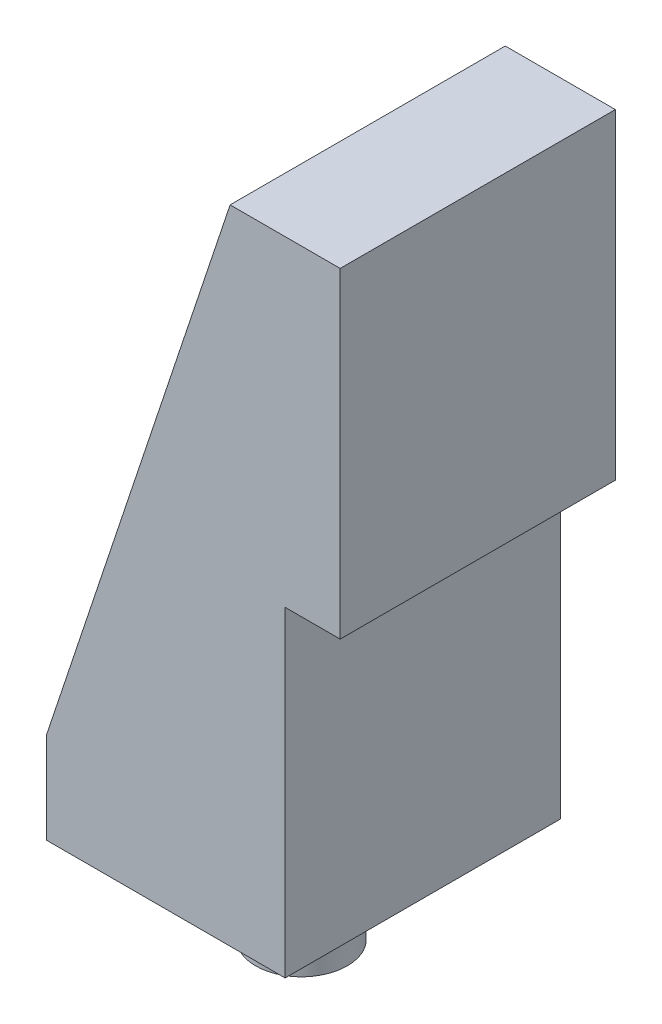
ISO-10303-21;
HEADER;
FILE_DESCRIPTION(('STEP AP214'),'2;1');
FILE_NAME('part.step','',(''),(''),'','','');
FILE_SCHEMA(('AUTOMOTIVE_DESIGN { 1 0 10303 214 1 1 1 1 }'));
ENDSEC;
DATA;
#1=APPLICATION_CONTEXT('core data for automotive mechanical design processes');
#2=APPLICATION_PROTOCOL_DEFINITION('international standard','automotive_design',2000,#1);
#3=PRODUCT_CONTEXT('',#1,'mechanical');
#4=PRODUCT('Part','Part','',(#3));
#5=PRODUCT_RELATED_PRODUCT_CATEGORY('part','',(#4));
#6=PRODUCT_DEFINITION_FORMATION('','',#4);
#7=PRODUCT_DEFINITION_CONTEXT('part definition',#1,'design');
#8=PRODUCT_DEFINITION('design','',#6,#7);
#9=PRODUCT_DEFINITION_SHAPE('','',#8);
#10=(LENGTH_UNIT() NAMED_UNIT(*) SI_UNIT(.MILLI.,.METRE.));
#11=(NAMED_UNIT(*) PLANE_ANGLE_UNIT() SI_UNIT($,.RADIAN.));
#12=(NAMED_UNIT(*) SI_UNIT($,.STERADIAN.) SOLID_ANGLE_UNIT());
#13=UNCERTAINTY_MEASURE_WITH_UNIT(LENGTH_MEASURE(1.E-05),#10,'distance_accuracy_value','');
#14=(GEOMETRIC_REPRESENTATION_CONTEXT(3) GLOBAL_UNCERTAINTY_ASSIGNED_CONTEXT((#13)) GLOBAL_UNIT_ASSIGNED_CONTEXT((#10,
#11,#12)) REPRESENTATION_CONTEXT('',''));
#15=CARTESIAN_POINT('',(0.,0.,0.));
#16=DIRECTION('',(0.,0.,1.));
#17=DIRECTION('',(1.,0.,0.));
#18=AXIS2_PLACEMENT_3D('',#15,#16,#17);
#19=CARTESIAN_POINT('',(0.,0.,1.5));
#20=DIRECTION('',(0.,1.,0.));
#21=DIRECTION('',(0.,0.,1.));
#22=AXIS2_PLACEMENT_3D('',#19,#20,#21);
#23=PLANE('',#22);
#24=DIRECTION('',(1.,0.,0.));
#25=VECTOR('',#24,1.);
#26=CARTESIAN_POINT('',(0.,0.,0.));
#27=LINE('',#26,#25);
#28=CARTESIAN_POINT('',(0.,0.,0.));
#29=VERTEX_POINT('',#28);
#30=CARTESIAN_POINT('',(1.3,0.,0.));
#31=VERTEX_POINT('',#30);
#32=EDGE_CURVE('E130',#29,#31,#27,.T.);
#33=ORIENTED_EDGE('',*,*,#32,.T.);
#34=DIRECTION('',(0.,0.,-1.));
#35=VECTOR('',#34,1.);
#36=CARTESIAN_POINT('',(1.3,0.,1.5));
#37=LINE('',#36,#35);
#38=CARTESIAN_POINT('',(1.3,0.,1.5));
#39=VERTEX_POINT('',#38);
#40=EDGE_CURVE('E147',#39,#31,#37,.T.);
#41=ORIENTED_EDGE('',*,*,#40,.F.);
#42=DIRECTION('',(1.,0.,0.));
#43=VECTOR('',#42,1.);
#44=CARTESIAN_POINT('',(0.,0.,1.5));
#45=LINE('',#44,#43);
#46=CARTESIAN_POINT('',(0.,0.,1.5));
#47=VERTEX_POINT('',#46);
#48=EDGE_CURVE('E92',#47,#39,#45,.T.);
#49=ORIENTED_EDGE('',*,*,#48,.F.);
#50=DIRECTION('',(0.,0.,-1.));
#51=VECTOR('',#50,1.);
#52=CARTESIAN_POINT('',(0.,0.,1.5));
#53=LINE('',#52,#51);
#54=EDGE_CURVE('E44',#47,#29,#53,.T.);
#55=ORIENTED_EDGE('',*,*,#54,.T.);
#56=EDGE_LOOP('',(#33,#41,#49,#55));
#57=FACE_BOUND('',#56,.T.);
#58=CARTESIAN_POINT('',(0.662330501171482,0.,0.77331630145494));
#59=DIRECTION('',(0.,1.,0.));
#60=DIRECTION('',(0.,0.,1.));
#61=AXIS2_PLACEMENT_3D('',#58,#59,#60);
#62=CIRCLE('',#61,0.25);
#63=CARTESIAN_POINT('',(0.662330501171482,0.,1.02331630145494));
#64=VERTEX_POINT('',#63);
#65=EDGE_CURVE('E11',#64,#64,#62,.F.);
#66=ORIENTED_EDGE('',*,*,#65,.F.);
#67=EDGE_LOOP('',(#66));
#68=FACE_BOUND('',#67,.T.);
#69=ADVANCED_FACE('F35',(#57,#68),#23,.F.);
#70=CARTESIAN_POINT('',(0.,0.5,1.5));
#71=DIRECTION('',(1.,0.,0.));
#72=DIRECTION('',(0.,1.,0.));
#73=AXIS2_PLACEMENT_3D('',#70,#71,#72);
#74=PLANE('',#73);
#75=DIRECTION('',(0.,-1.,0.));
#76=VECTOR('',#75,1.);
#77=CARTESIAN_POINT('',(0.,0.5,0.));
#78=LINE('',#77,#76);
#79=CARTESIAN_POINT('',(0.,0.5,0.));
#80=VERTEX_POINT('',#79);
#81=EDGE_CURVE('E127',#80,#29,#78,.T.);
#82=ORIENTED_EDGE('',*,*,#81,.T.);
#83=ORIENTED_EDGE('',*,*,#54,.F.);
#84=DIRECTION('',(0.,-1.,0.));
#85=VECTOR('',#84,1.);
#86=CARTESIAN_POINT('',(0.,0.5,1.5));
#87=LINE('',#86,#85);
#88=CARTESIAN_POINT('',(0.,0.5,1.5));
#89=VERTEX_POINT('',#88);
#90=EDGE_CURVE('E140',#89,#47,#87,.T.);
#91=ORIENTED_EDGE('',*,*,#90,.F.);
#92=DIRECTION('',(0.,0.,-1.));
#93=VECTOR('',#92,1.);
#94=CARTESIAN_POINT('',(0.,0.5,1.5));
#95=LINE('',#94,#93);
#96=EDGE_CURVE('E123',#89,#80,#95,.T.);
#97=ORIENTED_EDGE('',*,*,#96,.T.);
#98=EDGE_LOOP('',(#82,#83,#91,#97));
#99=FACE_BOUND('',#98,.T.);
#100=ADVANCED_FACE('F37',(#99),#74,.F.);
#101=CARTESIAN_POINT('',(1.3,0.,1.5));
#102=DIRECTION('',(-1.,0.,0.));
#103=DIRECTION('',(0.,0.,1.));
#104=AXIS2_PLACEMENT_3D('',#101,#102,#103);
#105=PLANE('',#104);
#106=DIRECTION('',(0.,1.,0.));
#107=VECTOR('',#106,1.);
#108=CARTESIAN_POINT('',(1.3,0.,0.));
#109=LINE('',#108,#107);
#110=CARTESIAN_POINT('',(1.3,1.75,0.));
#111=VERTEX_POINT('',#110);
#112=EDGE_CURVE('E133',#31,#111,#109,.T.);
#113=ORIENTED_EDGE('',*,*,#112,.T.);
#114=DIRECTION('',(0.,0.,-1.));
#115=VECTOR('',#114,1.);
#116=CARTESIAN_POINT('',(1.3,1.75,1.5));
#117=LINE('',#116,#115);
#118=CARTESIAN_POINT('',(1.3,1.75,1.5));
#119=VERTEX_POINT('',#118);
#120=EDGE_CURVE('E144',#119,#111,#117,.T.);
#121=ORIENTED_EDGE('',*,*,#120,.F.);
#122=DIRECTION('',(0.,1.,0.));
#123=VECTOR('',#122,1.);
#124=CARTESIAN_POINT('',(1.3,0.,1.5));
#125=LINE('',#124,#123);
#126=EDGE_CURVE('E164',#39,#119,#125,.T.);
#127=ORIENTED_EDGE('',*,*,#126,.F.);
#128=ORIENTED_EDGE('',*,*,#40,.T.);
#129=EDGE_LOOP('',(#113,#121,#127,#128));
#130=FACE_BOUND('',#129,.T.);
#131=ADVANCED_FACE('F160',(#130),#105,.F.);
#132=CARTESIAN_POINT('',(1.6,1.75,1.5));
#133=DIRECTION('',(0.,1.,0.));
#134=DIRECTION('',(0.,0.,1.));
#135=AXIS2_PLACEMENT_3D('',#132,#133,#134);
#136=PLANE('',#135);
#137=DIRECTION('',(1.,0.,0.));
#138=VECTOR('',#137,1.);
#139=CARTESIAN_POINT('',(1.6,1.75,0.));
#140=LINE('',#139,#138);
#141=CARTESIAN_POINT('',(1.6,1.75,0.));
#142=VERTEX_POINT('',#141);
#143=EDGE_CURVE('E135',#111,#142,#140,.T.);
#144=ORIENTED_EDGE('',*,*,#143,.T.);
#145=DIRECTION('',(0.,0.,-1.));
#146=VECTOR('',#145,1.);
#147=CARTESIAN_POINT('',(1.6,1.75,1.5));
#148=LINE('',#147,#146);
#149=CARTESIAN_POINT('',(1.6,1.75,1.5));
#150=VERTEX_POINT('',#149);
#151=EDGE_CURVE('E118',#150,#142,#148,.T.);
#152=ORIENTED_EDGE('',*,*,#151,.F.);
#153=DIRECTION('',(1.,0.,0.));
#154=VECTOR('',#153,1.);
#155=CARTESIAN_POINT('',(1.6,1.75,1.5));
#156=LINE('',#155,#154);
#157=EDGE_CURVE('E108',#119,#150,#156,.T.);
#158=ORIENTED_EDGE('',*,*,#157,.F.);
#159=ORIENTED_EDGE('',*,*,#120,.T.);
#160=EDGE_LOOP('',(#144,#152,#158,#159));
#161=FACE_BOUND('',#160,.T.);
#162=ADVANCED_FACE('F163',(#161),#136,.F.);
#163=CARTESIAN_POINT('',(1.6,3.5,1.5));
#164=DIRECTION('',(-1.,0.,0.));
#165=DIRECTION('',(0.,-1.,0.));
#166=AXIS2_PLACEMENT_3D('',#163,#164,#165);
#167=PLANE('',#166);
#168=DIRECTION('',(0.,1.,0.));
#169=VECTOR('',#168,1.);
#170=CARTESIAN_POINT('',(1.6,3.5,0.));
#171=LINE('',#170,#169);
#172=CARTESIAN_POINT('',(1.6,3.5,0.));
#173=VERTEX_POINT('',#172);
#174=EDGE_CURVE('E117',#142,#173,#171,.T.);
#175=ORIENTED_EDGE('',*,*,#174,.T.);
#176=DIRECTION('',(0.,0.,-1.));
#177=VECTOR('',#176,1.);
#178=CARTESIAN_POINT('',(1.6,3.5,1.5));
#179=LINE('',#178,#177);
#180=CARTESIAN_POINT('',(1.6,3.5,1.5));
#181=VERTEX_POINT('',#180);
#182=EDGE_CURVE('E114',#181,#173,#179,.T.);
#183=ORIENTED_EDGE('',*,*,#182,.F.);
#184=DIRECTION('',(0.,1.,0.));
#185=VECTOR('',#184,1.);
#186=CARTESIAN_POINT('',(1.6,3.5,1.5));
#187=LINE('',#186,#185);
#188=EDGE_CURVE('E102',#150,#181,#187,.T.);
#189=ORIENTED_EDGE('',*,*,#188,.F.);
#190=ORIENTED_EDGE('',*,*,#151,.T.);
#191=EDGE_LOOP('',(#175,#183,#189,#190));
#192=FACE_BOUND('',#191,.T.);
#193=ADVANCED_FACE('F115',(#192),#167,.F.);
#194=CARTESIAN_POINT('',(1.3,3.5,1.5));
#195=DIRECTION('',(0.,-1.,0.));
#196=DIRECTION('',(1.,0.,0.));
#197=AXIS2_PLACEMENT_3D('',#194,#195,#196);
#198=PLANE('',#197);
#199=DIRECTION('',(-1.,0.,0.));
#200=VECTOR('',#199,1.);
#201=CARTESIAN_POINT('',(1.3,3.5,0.));
#202=LINE('',#201,#200);
#203=CARTESIAN_POINT('',(1.,3.5,0.));
#204=VERTEX_POINT('',#203);
#205=EDGE_CURVE('E77',#173,#204,#202,.T.);
#206=ORIENTED_EDGE('',*,*,#205,.T.);
#207=DIRECTION('',(0.,0.,-1.));
#208=VECTOR('',#207,1.);
#209=CARTESIAN_POINT('',(1.,3.5,1.5));
#210=LINE('',#209,#208);
#211=CARTESIAN_POINT('',(1.,3.5,1.5));
#212=VERTEX_POINT('',#211);
#213=EDGE_CURVE('E119',#212,#204,#210,.T.);
#214=ORIENTED_EDGE('',*,*,#213,.F.);
#215=DIRECTION('',(-1.,0.,0.));
#216=VECTOR('',#215,1.);
#217=CARTESIAN_POINT('',(1.3,3.5,1.5));
#218=LINE('',#217,#216);
#219=EDGE_CURVE('E106',#181,#212,#218,.T.);
#220=ORIENTED_EDGE('',*,*,#219,.F.);
#221=ORIENTED_EDGE('',*,*,#182,.T.);
#222=EDGE_LOOP('',(#206,#214,#220,#221));
#223=FACE_BOUND('',#222,.T.);
#224=ADVANCED_FACE('F121',(#223),#198,.F.);
#225=CARTESIAN_POINT('',(1.,3.5,1.5));
#226=DIRECTION('',(0.948683298050514,-0.316227766016838,0.));
#227=DIRECTION('',(0.316227766016838,0.948683298050514,0.));
#228=AXIS2_PLACEMENT_3D('',#225,#226,#227);
#229=PLANE('',#228);
#230=DIRECTION('',(-0.316227766016838,-0.948683298050514,0.));
#231=VECTOR('',#230,1.);
#232=CARTESIAN_POINT('',(1.,3.5,0.));
#233=LINE('',#232,#231);
#234=EDGE_CURVE('E83',#204,#80,#233,.T.);
#235=ORIENTED_EDGE('',*,*,#234,.T.);
#236=ORIENTED_EDGE('',*,*,#96,.F.);
#237=DIRECTION('',(-0.316227766016838,-0.948683298050514,0.));
#238=VECTOR('',#237,1.);
#239=CARTESIAN_POINT('',(1.,3.5,1.5));
#240=LINE('',#239,#238);
#241=EDGE_CURVE('E52',#212,#89,#240,.T.);
#242=ORIENTED_EDGE('',*,*,#241,.F.);
#243=ORIENTED_EDGE('',*,*,#213,.T.);
#244=EDGE_LOOP('',(#235,#236,#242,#243));
#245=FACE_BOUND('',#244,.T.);
#246=ADVANCED_FACE('F194',(#245),#229,.F.);
#247=CARTESIAN_POINT('',(0.,0.,1.5));
#248=DIRECTION('',(0.,0.,1.));
#249=DIRECTION('',(1.,0.,0.));
#250=AXIS2_PLACEMENT_3D('',#247,#248,#249);
#251=PLANE('',#250);
#252=ORIENTED_EDGE('',*,*,#90,.T.);
#253=ORIENTED_EDGE('',*,*,#48,.T.);
#254=ORIENTED_EDGE('',*,*,#126,.T.);
#255=ORIENTED_EDGE('',*,*,#157,.T.);
#256=ORIENTED_EDGE('',*,*,#188,.T.);
#257=ORIENTED_EDGE('',*,*,#219,.T.);
#258=ORIENTED_EDGE('',*,*,#241,.T.);
#259=EDGE_LOOP('',(#252,#253,#254,#255,#256,#257,#258));
#260=FACE_BOUND('',#259,.T.);
#261=ADVANCED_FACE('F104',(#260),#251,.T.);
#262=CARTESIAN_POINT('',(0.,0.,0.));
#263=DIRECTION('',(0.,0.,1.));
#264=DIRECTION('',(1.,0.,0.));
#265=AXIS2_PLACEMENT_3D('',#262,#263,#264);
#266=PLANE('',#265);
#267=ORIENTED_EDGE('',*,*,#81,.F.);
#268=ORIENTED_EDGE('',*,*,#234,.F.);
#269=ORIENTED_EDGE('',*,*,#205,.F.);
#270=ORIENTED_EDGE('',*,*,#174,.F.);
#271=ORIENTED_EDGE('',*,*,#143,.F.);
#272=ORIENTED_EDGE('',*,*,#112,.F.);
#273=ORIENTED_EDGE('',*,*,#32,.F.);
#274=EDGE_LOOP('',(#267,#268,#269,#270,#271,#272,#273));
#275=FACE_BOUND('',#274,.T.);
#276=ADVANCED_FACE('F155',(#275),#266,.F.);
#277=CARTESIAN_POINT('',(0.662330501171482,-0.5,0.77331630145494));
#278=DIRECTION('',(0.,1.,0.));
#279=DIRECTION('',(0.,0.,1.));
#280=AXIS2_PLACEMENT_3D('',#277,#278,#279);
#281=CYLINDRICAL_SURFACE('',#280,0.25);
#282=CARTESIAN_POINT('',(0.662330501171482,-0.5,0.77331630145494));
#283=DIRECTION('',(0.,-1.,0.));
#284=DIRECTION('',(0.,0.,-1.));
#285=AXIS2_PLACEMENT_3D('',#282,#283,#284);
#286=CIRCLE('',#285,0.25);
#287=CARTESIAN_POINT('',(0.662330501171482,-0.5,0.52331630145494));
#288=VERTEX_POINT('',#287);
#289=EDGE_CURVE('E131',#288,#288,#286,.T.);
#290=ORIENTED_EDGE('',*,*,#289,.F.);
#291=EDGE_LOOP('',(#290));
#292=FACE_BOUND('',#291,.T.);
#293=ORIENTED_EDGE('',*,*,#65,.T.);
#294=EDGE_LOOP('',(#293));
#295=FACE_BOUND('',#294,.T.);
#296=ADVANCED_FACE('F174',(#292,#295),#281,.T.);
#297=CARTESIAN_POINT('',(0.662330501171482,-0.5,0.77331630145494));
#298=DIRECTION('',(0.,-1.,0.));
#299=DIRECTION('',(0.,0.,-1.));
#300=AXIS2_PLACEMENT_3D('',#297,#298,#299);
#301=PLANE('',#300);
#302=ORIENTED_EDGE('',*,*,#289,.T.);
#303=EDGE_LOOP('',(#302));
#304=FACE_BOUND('',#303,.T.);
#305=ADVANCED_FACE('F172',(#304),#301,.T.);
#306=CLOSED_SHELL('',(#69,#100,#131,#162,#193,#224,#246,#261,#276,#296,#305));
#307=MANIFOLD_SOLID_BREP('B2',#306);
#308=ADVANCED_BREP_SHAPE_REPRESENTATION('',(#18,#307),#14);
#309=SHAPE_DEFINITION_REPRESENTATION(#9,#308);
ENDSEC;
END-ISO-10303-21;
